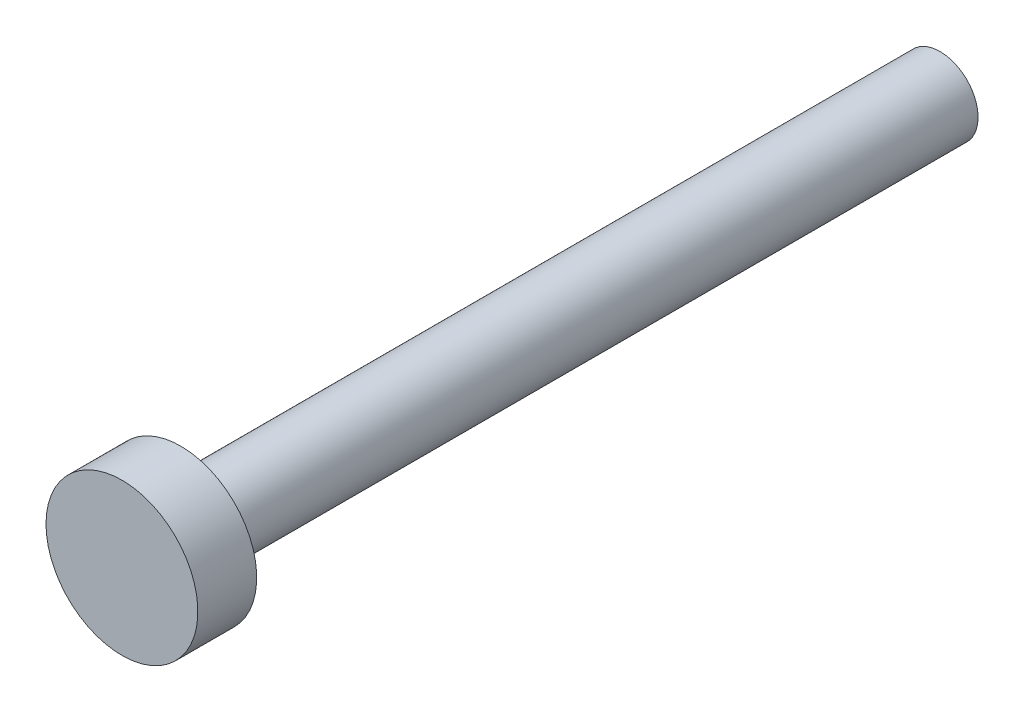
ISO-10303-21;
HEADER;
FILE_DESCRIPTION(('STEP AP214'),'2;1');
FILE_NAME('part.step','',(''),(''),'','','');
FILE_SCHEMA(('AUTOMOTIVE_DESIGN { 1 0 10303 214 1 1 1 1 }'));
ENDSEC;
DATA;
#1=APPLICATION_CONTEXT('core data for automotive mechanical design processes');
#2=APPLICATION_PROTOCOL_DEFINITION('international standard','automotive_design',2000,#1);
#3=PRODUCT_CONTEXT('',#1,'mechanical');
#4=PRODUCT('Part','Part','',(#3));
#5=PRODUCT_RELATED_PRODUCT_CATEGORY('part','',(#4));
#6=PRODUCT_DEFINITION_FORMATION('','',#4);
#7=PRODUCT_DEFINITION_CONTEXT('part definition',#1,'design');
#8=PRODUCT_DEFINITION('design','',#6,#7);
#9=PRODUCT_DEFINITION_SHAPE('','',#8);
#10=(LENGTH_UNIT() NAMED_UNIT(*) SI_UNIT(.MILLI.,.METRE.));
#11=(NAMED_UNIT(*) PLANE_ANGLE_UNIT() SI_UNIT($,.RADIAN.));
#12=(NAMED_UNIT(*) SI_UNIT($,.STERADIAN.) SOLID_ANGLE_UNIT());
#13=UNCERTAINTY_MEASURE_WITH_UNIT(LENGTH_MEASURE(1.E-05),#10,'distance_accuracy_value','');
#14=(GEOMETRIC_REPRESENTATION_CONTEXT(3) GLOBAL_UNCERTAINTY_ASSIGNED_CONTEXT((#13)) GLOBAL_UNIT_ASSIGNED_CONTEXT((#10,
#11,#12)) REPRESENTATION_CONTEXT('',''));
#15=CARTESIAN_POINT('',(0.,0.,0.));
#16=DIRECTION('',(0.,0.,1.));
#17=DIRECTION('',(1.,0.,0.));
#18=AXIS2_PLACEMENT_3D('',#15,#16,#17);
#19=CARTESIAN_POINT('',(0.,0.,3.1));
#20=DIRECTION('',(0.,0.,-1.));
#21=DIRECTION('',(-1.,0.,0.));
#22=AXIS2_PLACEMENT_3D('',#19,#20,#21);
#23=CYLINDRICAL_SURFACE('',#22,4.);
#24=CARTESIAN_POINT('',(0.,0.,3.1));
#25=DIRECTION('',(0.,0.,1.));
#26=DIRECTION('',(1.,0.,0.));
#27=AXIS2_PLACEMENT_3D('',#24,#25,#26);
#28=CIRCLE('',#27,4.);
#29=CARTESIAN_POINT('',(-4.,0.,3.1));
#30=VERTEX_POINT('',#29);
#31=EDGE_CURVE('E38',#30,#30,#28,.T.);
#32=CARTESIAN_POINT('',(0.,0.,0.));
#33=DIRECTION('',(0.,0.,1.));
#34=DIRECTION('',(1.,0.,0.));
#35=AXIS2_PLACEMENT_3D('',#32,#33,#34);
#36=CIRCLE('',#35,4.);
#37=CARTESIAN_POINT('',(-4.,0.,0.));
#38=VERTEX_POINT('',#37);
#39=EDGE_CURVE('E34',#38,#38,#36,.T.);
#40=CARTESIAN_POINT('',(-4.,0.,3.1));
#41=CARTESIAN_POINT('',(-4.,0.,3.06770833333333));
#42=CARTESIAN_POINT('',(-4.,0.,3.03541666666667));
#43=CARTESIAN_POINT('',(-4.,0.,2.97083333333333));
#44=CARTESIAN_POINT('',(-4.,0.,2.93854166666667));
#45=CARTESIAN_POINT('',(-4.,0.,2.87395833333333));
#46=CARTESIAN_POINT('',(-4.,0.,2.84166666666667));
#47=CARTESIAN_POINT('',(-4.,0.,2.77708333333333));
#48=CARTESIAN_POINT('',(-4.,0.,2.74479166666667));
#49=CARTESIAN_POINT('',(-4.,0.,2.68020833333333));
#50=CARTESIAN_POINT('',(-4.,0.,2.64791666666667));
#51=CARTESIAN_POINT('',(-4.,0.,2.58333333333333));
#52=CARTESIAN_POINT('',(-4.,0.,2.55104166666667));
#53=CARTESIAN_POINT('',(-4.,0.,2.48645833333333));
#54=CARTESIAN_POINT('',(-4.,0.,2.45416666666667));
#55=CARTESIAN_POINT('',(-4.,0.,2.38958333333333));
#56=CARTESIAN_POINT('',(-4.,0.,2.35729166666667));
#57=CARTESIAN_POINT('',(-4.,0.,2.29270833333333));
#58=CARTESIAN_POINT('',(-4.,0.,2.26041666666667));
#59=CARTESIAN_POINT('',(-4.,0.,2.19583333333333));
#60=CARTESIAN_POINT('',(-4.,0.,2.16354166666667));
#61=CARTESIAN_POINT('',(-4.,0.,2.09895833333333));
#62=CARTESIAN_POINT('',(-4.,0.,2.06666666666667));
#63=CARTESIAN_POINT('',(-4.,0.,2.00208333333333));
#64=CARTESIAN_POINT('',(-4.,0.,1.96979166666667));
#65=CARTESIAN_POINT('',(-4.,0.,1.90520833333333));
#66=CARTESIAN_POINT('',(-4.,0.,1.87291666666667));
#67=CARTESIAN_POINT('',(-4.,0.,1.80833333333333));
#68=CARTESIAN_POINT('',(-4.,0.,1.77604166666667));
#69=CARTESIAN_POINT('',(-4.,0.,1.71145833333333));
#70=CARTESIAN_POINT('',(-4.,0.,1.67916666666667));
#71=CARTESIAN_POINT('',(-4.,0.,1.61458333333333));
#72=CARTESIAN_POINT('',(-4.,0.,1.58229166666667));
#73=CARTESIAN_POINT('',(-4.,0.,1.51770833333333));
#74=CARTESIAN_POINT('',(-4.,0.,1.48541666666667));
#75=CARTESIAN_POINT('',(-4.,0.,1.42083333333333));
#76=CARTESIAN_POINT('',(-4.,0.,1.38854166666667));
#77=CARTESIAN_POINT('',(-4.,0.,1.32395833333333));
#78=CARTESIAN_POINT('',(-4.,0.,1.29166666666667));
#79=CARTESIAN_POINT('',(-4.,0.,1.22708333333333));
#80=CARTESIAN_POINT('',(-4.,0.,1.19479166666667));
#81=CARTESIAN_POINT('',(-4.,0.,1.13020833333333));
#82=CARTESIAN_POINT('',(-4.,0.,1.09791666666667));
#83=CARTESIAN_POINT('',(-4.,0.,1.03333333333333));
#84=CARTESIAN_POINT('',(-4.,0.,1.00104166666667));
#85=CARTESIAN_POINT('',(-4.,0.,0.936458333333333));
#86=CARTESIAN_POINT('',(-4.,0.,0.904166666666667));
#87=CARTESIAN_POINT('',(-4.,0.,0.839583333333333));
#88=CARTESIAN_POINT('',(-4.,0.,0.807291666666667));
#89=CARTESIAN_POINT('',(-4.,0.,0.742708333333333));
#90=CARTESIAN_POINT('',(-4.,0.,0.710416666666667));
#91=CARTESIAN_POINT('',(-4.,0.,0.645833333333333));
#92=CARTESIAN_POINT('',(-4.,0.,0.613541666666667));
#93=CARTESIAN_POINT('',(-4.,0.,0.548958333333333));
#94=CARTESIAN_POINT('',(-4.,0.,0.516666666666667));
#95=CARTESIAN_POINT('',(-4.,0.,0.452083333333333));
#96=CARTESIAN_POINT('',(-4.,0.,0.419791666666667));
#97=CARTESIAN_POINT('',(-4.,0.,0.355208333333333));
#98=CARTESIAN_POINT('',(-4.,0.,0.322916666666667));
#99=CARTESIAN_POINT('',(-4.,0.,0.258333333333333));
#100=CARTESIAN_POINT('',(-4.,0.,0.226041666666667));
#101=CARTESIAN_POINT('',(-4.,0.,0.161458333333333));
#102=CARTESIAN_POINT('',(-4.,0.,0.129166666666667));
#103=CARTESIAN_POINT('',(-4.,0.,0.0645833333333335));
#104=CARTESIAN_POINT('',(-4.,0.,0.0322916666666667));
#105=CARTESIAN_POINT('',(-4.,0.,0.));
#106=B_SPLINE_CURVE_WITH_KNOTS('',3,(#40,#41,#42,#43,#44,#45,#46,#47,#48,#49,#50,#51,#52,#53,
#54,#55,#56,#57,#58,#59,#60,#61,#62,#63,#64,#65,#66,#67,#68,#69,#70,#71,#72,#73,#74,#75,#76,#77,
#78,#79,#80,#81,#82,#83,#84,#85,#86,#87,#88,#89,#90,#91,#92,#93,#94,#95,#96,#97,#98,#99,#100,
#101,#102,#103,#104,#105),.UNSPECIFIED.,.F.,.F.,(4,2,2,2,2,2,2,2,2,2,2,2,2,2,2,2,2,2,2,2,2,2,2,
2,2,2,2,2,2,2,2,2,4),(0.,0.0968749999999997,0.19375,0.290625,0.3875,0.484375,0.58125,0.678125,
0.775,0.871874999999999,0.96875,1.065625,1.1625,1.259375,1.35625,1.453125,1.55,1.646875,1.74375,
1.840625,1.9375,2.034375,2.13125,2.228125,2.325,2.421875,2.51875,2.615625,2.7125,2.809375,
2.90625,3.003125,3.1),.UNSPECIFIED.);
#107=EDGE_CURVE('BSEAM31',#30,#38,#106,.T.);
#108=ORIENTED_EDGE('',*,*,#31,.F.);
#109=ORIENTED_EDGE('',*,*,#39,.T.);
#110=ORIENTED_EDGE('',*,*,#107,.T.);
#111=ORIENTED_EDGE('',*,*,#107,.F.);
#112=EDGE_LOOP('',(#108,#110,#109,#111));
#113=FACE_BOUND('',#112,.T.);
#114=ADVANCED_FACE('F31',(#113),#23,.T.);
#115=CARTESIAN_POINT('',(0.,0.,3.1));
#116=DIRECTION('',(0.,0.,1.));
#117=DIRECTION('',(1.,0.,0.));
#118=AXIS2_PLACEMENT_3D('',#115,#116,#117);
#119=PLANE('',#118);
#120=ORIENTED_EDGE('',*,*,#31,.T.);
#121=EDGE_LOOP('',(#120));
#122=FACE_BOUND('',#121,.T.);
#123=ADVANCED_FACE('F55',(#122),#119,.T.);
#124=CARTESIAN_POINT('',(0.,0.,0.));
#125=DIRECTION('',(0.,0.,1.));
#126=DIRECTION('',(1.,0.,0.));
#127=AXIS2_PLACEMENT_3D('',#124,#125,#126);
#128=PLANE('',#127);
#129=CARTESIAN_POINT('',(0.,0.,0.));
#130=DIRECTION('',(0.,0.,-1.));
#131=DIRECTION('',(-1.,0.,0.));
#132=AXIS2_PLACEMENT_3D('',#129,#130,#131);
#133=CIRCLE('',#132,2.);
#134=CARTESIAN_POINT('',(-2.,0.,0.));
#135=VERTEX_POINT('',#134);
#136=EDGE_CURVE('E10',#135,#135,#133,.T.);
#137=ORIENTED_EDGE('',*,*,#136,.F.);
#138=EDGE_LOOP('',(#137));
#139=FACE_BOUND('',#138,.T.);
#140=ORIENTED_EDGE('',*,*,#39,.F.);
#141=EDGE_LOOP('',(#140));
#142=FACE_BOUND('',#141,.T.);
#143=ADVANCED_FACE('F52',(#139,#142),#128,.F.);
#144=CARTESIAN_POINT('',(0.,0.,-40.));
#145=DIRECTION('',(0.,0.,1.));
#146=DIRECTION('',(1.,0.,0.));
#147=AXIS2_PLACEMENT_3D('',#144,#145,#146);
#148=CYLINDRICAL_SURFACE('',#147,2.);
#149=CARTESIAN_POINT('',(0.,0.,-40.));
#150=DIRECTION('',(0.,0.,-1.));
#151=DIRECTION('',(-1.,0.,0.));
#152=AXIS2_PLACEMENT_3D('',#149,#150,#151);
#153=CIRCLE('',#152,2.);
#154=CARTESIAN_POINT('',(-2.,0.,-40.));
#155=VERTEX_POINT('',#154);
#156=EDGE_CURVE('E44',#155,#155,#153,.T.);
#157=ORIENTED_EDGE('',*,*,#156,.F.);
#158=EDGE_LOOP('',(#157));
#159=FACE_BOUND('',#158,.T.);
#160=ORIENTED_EDGE('',*,*,#136,.T.);
#161=EDGE_LOOP('',(#160));
#162=FACE_BOUND('',#161,.T.);
#163=ADVANCED_FACE('F54',(#159,#162),#148,.T.);
#164=CARTESIAN_POINT('',(0.,0.,-40.));
#165=DIRECTION('',(0.,0.,-1.));
#166=DIRECTION('',(-1.,0.,0.));
#167=AXIS2_PLACEMENT_3D('',#164,#165,#166);
#168=PLANE('',#167);
#169=ORIENTED_EDGE('',*,*,#156,.T.);
#170=EDGE_LOOP('',(#169));
#171=FACE_BOUND('',#170,.T.);
#172=ADVANCED_FACE('F61',(#171),#168,.T.);
#173=CLOSED_SHELL('',(#114,#123,#143,#163,#172));
#174=MANIFOLD_SOLID_BREP('B2',#173);
#175=ADVANCED_BREP_SHAPE_REPRESENTATION('',(#18,#174),#14);
#176=SHAPE_DEFINITION_REPRESENTATION(#9,#175);
ENDSEC;
END-ISO-10303-21;
